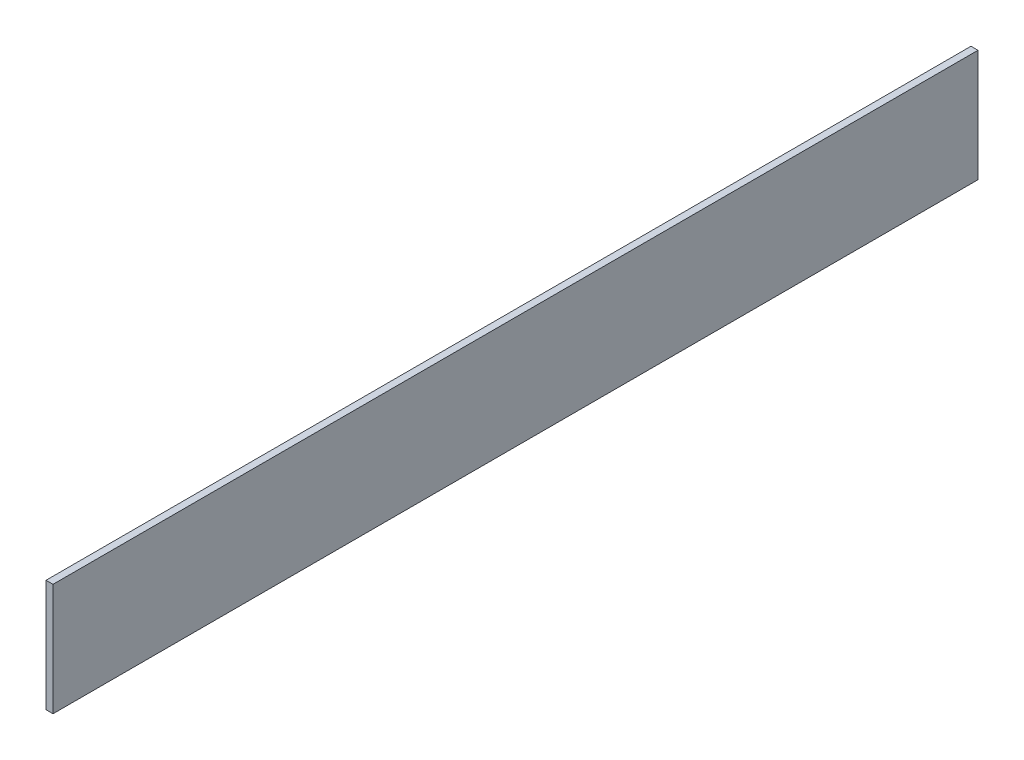
ISO-10303-21;
HEADER;
FILE_DESCRIPTION(('STEP AP214'),'2;1');
FILE_NAME('part.step','',(''),(''),'','','');
FILE_SCHEMA(('AUTOMOTIVE_DESIGN { 1 0 10303 214 1 1 1 1 }'));
ENDSEC;
DATA;
#1=APPLICATION_CONTEXT('core data for automotive mechanical design processes');
#2=APPLICATION_PROTOCOL_DEFINITION('international standard','automotive_design',2000,#1);
#3=PRODUCT_CONTEXT('',#1,'mechanical');
#4=PRODUCT('Part','Part','',(#3));
#5=PRODUCT_RELATED_PRODUCT_CATEGORY('part','',(#4));
#6=PRODUCT_DEFINITION_FORMATION('','',#4);
#7=PRODUCT_DEFINITION_CONTEXT('part definition',#1,'design');
#8=PRODUCT_DEFINITION('design','',#6,#7);
#9=PRODUCT_DEFINITION_SHAPE('','',#8);
#10=(LENGTH_UNIT() NAMED_UNIT(*) SI_UNIT(.MILLI.,.METRE.));
#11=(NAMED_UNIT(*) PLANE_ANGLE_UNIT() SI_UNIT($,.RADIAN.));
#12=(NAMED_UNIT(*) SI_UNIT($,.STERADIAN.) SOLID_ANGLE_UNIT());
#13=UNCERTAINTY_MEASURE_WITH_UNIT(LENGTH_MEASURE(1.E-05),#10,'distance_accuracy_value','');
#14=(GEOMETRIC_REPRESENTATION_CONTEXT(3) GLOBAL_UNCERTAINTY_ASSIGNED_CONTEXT((#13)) GLOBAL_UNIT_ASSIGNED_CONTEXT((#10,
#11,#12)) REPRESENTATION_CONTEXT('',''));
#15=CARTESIAN_POINT('',(0.,0.,0.));
#16=DIRECTION('',(0.,0.,1.));
#17=DIRECTION('',(1.,0.,0.));
#18=AXIS2_PLACEMENT_3D('',#15,#16,#17);
#19=CARTESIAN_POINT('',(512.5,552.,-565.));
#20=DIRECTION('',(-1.,0.,0.));
#21=DIRECTION('',(0.,0.,1.));
#22=AXIS2_PLACEMENT_3D('',#19,#20,#21);
#23=PLANE('',#22);
#24=DIRECTION('',(0.,-1.,0.));
#25=VECTOR('',#24,1.);
#26=CARTESIAN_POINT('',(512.5,552.,-235.));
#27=LINE('',#26,#25);
#28=CARTESIAN_POINT('',(512.5,592.,-235.));
#29=VERTEX_POINT('',#28);
#30=CARTESIAN_POINT('',(512.5,552.,-235.));
#31=VERTEX_POINT('',#30);
#32=EDGE_CURVE('E103',#29,#31,#27,.T.);
#33=ORIENTED_EDGE('',*,*,#32,.F.);
#34=DIRECTION('',(0.,0.,1.));
#35=VECTOR('',#34,1.);
#36=CARTESIAN_POINT('',(512.5,592.,-565.));
#37=LINE('',#36,#35);
#38=CARTESIAN_POINT('',(512.5,592.,-565.));
#39=VERTEX_POINT('',#38);
#40=EDGE_CURVE('E11',#39,#29,#37,.T.);
#41=ORIENTED_EDGE('',*,*,#40,.F.);
#42=DIRECTION('',(0.,-1.,0.));
#43=VECTOR('',#42,1.);
#44=CARTESIAN_POINT('',(512.5,552.,-565.));
#45=LINE('',#44,#43);
#46=CARTESIAN_POINT('',(512.5,552.,-565.));
#47=VERTEX_POINT('',#46);
#48=EDGE_CURVE('E97',#39,#47,#45,.T.);
#49=ORIENTED_EDGE('',*,*,#48,.T.);
#50=DIRECTION('',(0.,0.,1.));
#51=VECTOR('',#50,1.);
#52=CARTESIAN_POINT('',(512.5,552.,-565.));
#53=LINE('',#52,#51);
#54=EDGE_CURVE('E42',#47,#31,#53,.T.);
#55=ORIENTED_EDGE('',*,*,#54,.T.);
#56=EDGE_LOOP('',(#33,#41,#49,#55));
#57=FACE_BOUND('',#56,.T.);
#58=ADVANCED_FACE('F39',(#57),#23,.T.);
#59=CARTESIAN_POINT('',(512.5,592.,-565.));
#60=DIRECTION('',(0.,1.,0.));
#61=DIRECTION('',(0.,0.,1.));
#62=AXIS2_PLACEMENT_3D('',#59,#60,#61);
#63=PLANE('',#62);
#64=DIRECTION('',(-1.,0.,0.));
#65=VECTOR('',#64,1.);
#66=CARTESIAN_POINT('',(512.5,592.,-235.));
#67=LINE('',#66,#65);
#68=CARTESIAN_POINT('',(515.,592.,-235.));
#69=VERTEX_POINT('',#68);
#70=EDGE_CURVE('E99',#69,#29,#67,.T.);
#71=ORIENTED_EDGE('',*,*,#70,.F.);
#72=DIRECTION('',(0.,0.,1.));
#73=VECTOR('',#72,1.);
#74=CARTESIAN_POINT('',(515.,592.,-565.));
#75=LINE('',#74,#73);
#76=CARTESIAN_POINT('',(515.,592.,-565.));
#77=VERTEX_POINT('',#76);
#78=EDGE_CURVE('E48',#77,#69,#75,.T.);
#79=ORIENTED_EDGE('',*,*,#78,.F.);
#80=DIRECTION('',(-1.,0.,0.));
#81=VECTOR('',#80,1.);
#82=CARTESIAN_POINT('',(512.5,592.,-565.));
#83=LINE('',#82,#81);
#84=EDGE_CURVE('E94',#77,#39,#83,.T.);
#85=ORIENTED_EDGE('',*,*,#84,.T.);
#86=ORIENTED_EDGE('',*,*,#40,.T.);
#87=EDGE_LOOP('',(#71,#79,#85,#86));
#88=FACE_BOUND('',#87,.T.);
#89=ADVANCED_FACE('F113',(#88),#63,.T.);
#90=CARTESIAN_POINT('',(515.,552.,-565.));
#91=DIRECTION('',(1.,0.,0.));
#92=DIRECTION('',(0.,0.,-1.));
#93=AXIS2_PLACEMENT_3D('',#90,#91,#92);
#94=PLANE('',#93);
#95=DIRECTION('',(0.,1.,0.));
#96=VECTOR('',#95,1.);
#97=CARTESIAN_POINT('',(515.,552.,-235.));
#98=LINE('',#97,#96);
#99=CARTESIAN_POINT('',(515.,552.,-235.));
#100=VERTEX_POINT('',#99);
#101=EDGE_CURVE('E89',#100,#69,#98,.T.);
#102=ORIENTED_EDGE('',*,*,#101,.F.);
#103=DIRECTION('',(0.,0.,1.));
#104=VECTOR('',#103,1.);
#105=CARTESIAN_POINT('',(515.,552.,-565.));
#106=LINE('',#105,#104);
#107=CARTESIAN_POINT('',(515.,552.,-565.));
#108=VERTEX_POINT('',#107);
#109=EDGE_CURVE('E84',#108,#100,#106,.T.);
#110=ORIENTED_EDGE('',*,*,#109,.F.);
#111=DIRECTION('',(0.,1.,0.));
#112=VECTOR('',#111,1.);
#113=CARTESIAN_POINT('',(515.,552.,-565.));
#114=LINE('',#113,#112);
#115=EDGE_CURVE('E87',#108,#77,#114,.T.);
#116=ORIENTED_EDGE('',*,*,#115,.T.);
#117=ORIENTED_EDGE('',*,*,#78,.T.);
#118=EDGE_LOOP('',(#102,#110,#116,#117));
#119=FACE_BOUND('',#118,.T.);
#120=ADVANCED_FACE('F86',(#119),#94,.T.);
#121=CARTESIAN_POINT('',(512.5,552.,-565.));
#122=DIRECTION('',(0.,-1.,0.));
#123=DIRECTION('',(0.,0.,-1.));
#124=AXIS2_PLACEMENT_3D('',#121,#122,#123);
#125=PLANE('',#124);
#126=DIRECTION('',(1.,0.,0.));
#127=VECTOR('',#126,1.);
#128=CARTESIAN_POINT('',(512.5,552.,-235.));
#129=LINE('',#128,#127);
#130=EDGE_CURVE('E106',#31,#100,#129,.T.);
#131=ORIENTED_EDGE('',*,*,#130,.F.);
#132=ORIENTED_EDGE('',*,*,#54,.F.);
#133=DIRECTION('',(1.,0.,0.));
#134=VECTOR('',#133,1.);
#135=CARTESIAN_POINT('',(512.5,552.,-565.));
#136=LINE('',#135,#134);
#137=EDGE_CURVE('E93',#47,#108,#136,.T.);
#138=ORIENTED_EDGE('',*,*,#137,.T.);
#139=ORIENTED_EDGE('',*,*,#109,.T.);
#140=EDGE_LOOP('',(#131,#132,#138,#139));
#141=FACE_BOUND('',#140,.T.);
#142=ADVANCED_FACE('F96',(#141),#125,.T.);
#143=CARTESIAN_POINT('',(0.,0.,-565.));
#144=DIRECTION('',(0.,0.,-1.));
#145=DIRECTION('',(-1.,0.,0.));
#146=AXIS2_PLACEMENT_3D('',#143,#144,#145);
#147=PLANE('',#146);
#148=ORIENTED_EDGE('',*,*,#48,.F.);
#149=ORIENTED_EDGE('',*,*,#84,.F.);
#150=ORIENTED_EDGE('',*,*,#115,.F.);
#151=ORIENTED_EDGE('',*,*,#137,.F.);
#152=EDGE_LOOP('',(#148,#149,#150,#151));
#153=FACE_BOUND('',#152,.T.);
#154=ADVANCED_FACE('F92',(#153),#147,.T.);
#155=CARTESIAN_POINT('',(0.,0.,-235.));
#156=DIRECTION('',(0.,0.,-1.));
#157=DIRECTION('',(-1.,0.,0.));
#158=AXIS2_PLACEMENT_3D('',#155,#156,#157);
#159=PLANE('',#158);
#160=ORIENTED_EDGE('',*,*,#32,.T.);
#161=ORIENTED_EDGE('',*,*,#130,.T.);
#162=ORIENTED_EDGE('',*,*,#101,.T.);
#163=ORIENTED_EDGE('',*,*,#70,.T.);
#164=EDGE_LOOP('',(#160,#161,#162,#163));
#165=FACE_BOUND('',#164,.T.);
#166=ADVANCED_FACE('F112',(#165),#159,.F.);
#167=CLOSED_SHELL('',(#58,#89,#120,#142,#154,#166));
#168=MANIFOLD_SOLID_BREP('B2',#167);
#169=ADVANCED_BREP_SHAPE_REPRESENTATION('',(#18,#168),#14);
#170=SHAPE_DEFINITION_REPRESENTATION(#9,#169);
ENDSEC;
END-ISO-10303-21;
